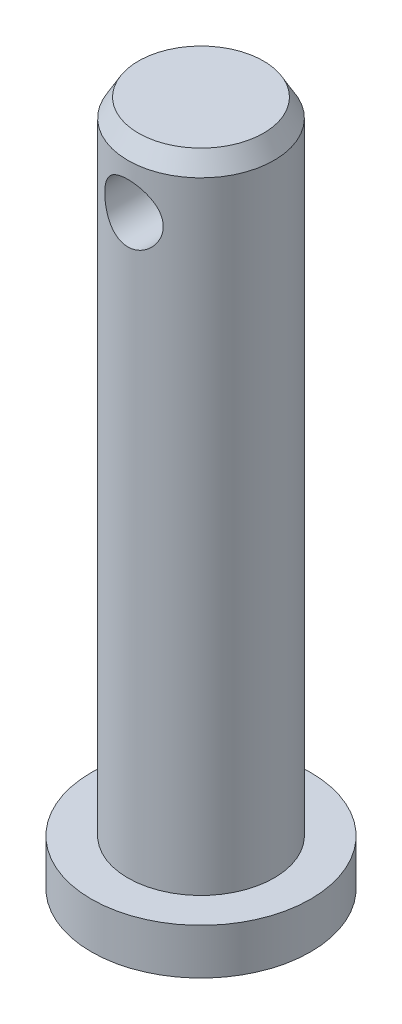
ISO-10303-21;
HEADER;
FILE_DESCRIPTION(('STEP AP214'),'2;1');
FILE_NAME('part.step','',(''),(''),'','','');
FILE_SCHEMA(('AUTOMOTIVE_DESIGN { 1 0 10303 214 1 1 1 1 }'));
ENDSEC;
DATA;
#1=APPLICATION_CONTEXT('core data for automotive mechanical design processes');
#2=APPLICATION_PROTOCOL_DEFINITION('international standard','automotive_design',2000,#1);
#3=PRODUCT_CONTEXT('',#1,'mechanical');
#4=PRODUCT('Part','Part','',(#3));
#5=PRODUCT_RELATED_PRODUCT_CATEGORY('part','',(#4));
#6=PRODUCT_DEFINITION_FORMATION('','',#4);
#7=PRODUCT_DEFINITION_CONTEXT('part definition',#1,'design');
#8=PRODUCT_DEFINITION('design','',#6,#7);
#9=PRODUCT_DEFINITION_SHAPE('','',#8);
#10=(LENGTH_UNIT() NAMED_UNIT(*) SI_UNIT(.MILLI.,.METRE.));
#11=(NAMED_UNIT(*) PLANE_ANGLE_UNIT() SI_UNIT($,.RADIAN.));
#12=(NAMED_UNIT(*) SI_UNIT($,.STERADIAN.) SOLID_ANGLE_UNIT());
#13=UNCERTAINTY_MEASURE_WITH_UNIT(LENGTH_MEASURE(1.E-05),#10,'distance_accuracy_value','');
#14=(GEOMETRIC_REPRESENTATION_CONTEXT(3) GLOBAL_UNCERTAINTY_ASSIGNED_CONTEXT((#13)) GLOBAL_UNIT_ASSIGNED_CONTEXT((#10,
#11,#12)) REPRESENTATION_CONTEXT('',''));
#15=CARTESIAN_POINT('',(0.,0.,0.));
#16=DIRECTION('',(0.,0.,1.));
#17=DIRECTION('',(1.,0.,0.));
#18=AXIS2_PLACEMENT_3D('',#15,#16,#17);
#19=CARTESIAN_POINT('',(0.,0.,0.));
#20=DIRECTION('',(0.,1.,0.));
#21=DIRECTION('',(0.,0.,1.));
#22=AXIS2_PLACEMENT_3D('',#19,#20,#21);
#23=PLANE('',#22);
#24=CARTESIAN_POINT('',(0.,0.,0.));
#25=DIRECTION('',(0.,1.,0.));
#26=DIRECTION('',(0.,0.,1.));
#27=AXIS2_PLACEMENT_3D('',#24,#25,#26);
#28=CIRCLE('',#27,6.);
#29=CARTESIAN_POINT('',(0.,0.,6.));
#30=VERTEX_POINT('',#29);
#31=EDGE_CURVE('E11',#30,#30,#28,.T.);
#32=ORIENTED_EDGE('',*,*,#31,.F.);
#33=EDGE_LOOP('',(#32));
#34=FACE_BOUND('',#33,.T.);
#35=ADVANCED_FACE('F42',(#34),#23,.F.);
#36=CARTESIAN_POINT('',(0.,0.,0.));
#37=DIRECTION('',(0.,1.,0.));
#38=DIRECTION('',(0.,0.,1.));
#39=AXIS2_PLACEMENT_3D('',#36,#37,#38);
#40=CYLINDRICAL_SURFACE('',#39,6.);
#41=CARTESIAN_POINT('',(0.,2.5,0.));
#42=DIRECTION('',(0.,1.,0.));
#43=DIRECTION('',(0.,0.,1.));
#44=AXIS2_PLACEMENT_3D('',#41,#42,#43);
#45=CIRCLE('',#44,6.);
#46=CARTESIAN_POINT('',(0.,2.5,6.));
#47=VERTEX_POINT('',#46);
#48=EDGE_CURVE('E55',#47,#47,#45,.T.);
#49=ORIENTED_EDGE('',*,*,#48,.F.);
#50=EDGE_LOOP('',(#49));
#51=FACE_BOUND('',#50,.T.);
#52=ORIENTED_EDGE('',*,*,#31,.T.);
#53=EDGE_LOOP('',(#52));
#54=FACE_BOUND('',#53,.T.);
#55=ADVANCED_FACE('F94',(#51,#54),#40,.T.);
#56=CARTESIAN_POINT('',(6.,2.5,0.));
#57=DIRECTION('',(0.,-1.,0.));
#58=DIRECTION('',(0.,0.,-1.));
#59=AXIS2_PLACEMENT_3D('',#56,#57,#58);
#60=PLANE('',#59);
#61=CARTESIAN_POINT('',(0.,2.5,0.));
#62=DIRECTION('',(0.,1.,0.));
#63=DIRECTION('',(0.,0.,1.));
#64=AXIS2_PLACEMENT_3D('',#61,#62,#63);
#65=CIRCLE('',#64,4.);
#66=CARTESIAN_POINT('',(0.,2.5,4.));
#67=VERTEX_POINT('',#66);
#68=EDGE_CURVE('E61',#67,#67,#65,.T.);
#69=ORIENTED_EDGE('',*,*,#68,.F.);
#70=EDGE_LOOP('',(#69));
#71=FACE_BOUND('',#70,.T.);
#72=ORIENTED_EDGE('',*,*,#48,.T.);
#73=EDGE_LOOP('',(#72));
#74=FACE_BOUND('',#73,.T.);
#75=ADVANCED_FACE('F89',(#71,#74),#60,.F.);
#76=CARTESIAN_POINT('',(0.,0.,0.));
#77=DIRECTION('',(0.,1.,0.));
#78=DIRECTION('',(0.,0.,1.));
#79=AXIS2_PLACEMENT_3D('',#76,#77,#78);
#80=CYLINDRICAL_SURFACE('',#79,4.);
#81=CARTESIAN_POINT('',(0.,32.4,4.));
#82=CARTESIAN_POINT('',(-0.0859944043543135,32.400007881459,3.99999416981668));
#83=CARTESIAN_POINT('',(-0.17213805127254,32.4069742016707,3.99719435445546));
#84=CARTESIAN_POINT('',(-0.341997184334318,32.434598162817,3.98626762480513));
#85=CARTESIAN_POINT('',(-0.425705422048999,32.4552930232689,3.97812622959102));
#86=CARTESIAN_POINT('',(-0.587963138181924,32.5095008624471,3.95739367370495));
#87=CARTESIAN_POINT('',(-0.666528529293571,32.5429718769734,3.94481709091258));
#88=CARTESIAN_POINT('',(-0.816857576262698,32.6216153386612,3.91645288636862));
#89=CARTESIAN_POINT('',(-0.888623581400796,32.6667837239352,3.90066637966445));
#90=CARTESIAN_POINT('',(-1.02680080605632,32.7697883988488,3.86664708936335));
#91=CARTESIAN_POINT('',(-1.09284981804017,32.8280853249922,3.84833837543352));
#92=CARTESIAN_POINT('',(-1.21454000382778,32.9547200027814,3.81168461524956));
#93=CARTESIAN_POINT('',(-1.27017608570683,33.0230626377694,3.79333955563034));
#94=CARTESIAN_POINT('',(-1.3718996538343,33.1715424561938,3.75778233437709));
#95=CARTESIAN_POINT('',(-1.41745198495638,33.2520691888186,3.74065692771961));
#96=CARTESIAN_POINT('',(-1.49420377522972,33.420429118736,3.71066917749434));
#97=CARTESIAN_POINT('',(-1.52541005142867,33.5082588222787,3.69780480995341));
#98=CARTESIAN_POINT('',(-1.57111905871669,33.6845698668737,3.67861086128655));
#99=CARTESIAN_POINT('',(-1.58631517264452,33.772840988461,3.67201136284484));
#100=CARTESIAN_POINT('',(-1.60173836931202,33.9509079986458,3.66531203239315));
#101=CARTESIAN_POINT('',(-1.60197281305058,34.0407031157,3.66520900418215));
#102=CARTESIAN_POINT('',(-1.58799149400363,34.2126053371664,3.67128400223995));
#103=CARTESIAN_POINT('',(-1.57478025144411,34.2948125715272,3.6770254003076));
#104=CARTESIAN_POINT('',(-1.53595750423825,34.4557276448054,3.69340950086269));
#105=CARTESIAN_POINT('',(-1.5103438358437,34.5344348704882,3.70405305857338));
#106=CARTESIAN_POINT('',(-1.44695578604086,34.6880142689568,3.72927588070824));
#107=CARTESIAN_POINT('',(-1.40894388985225,34.7627753912438,3.7439310342463));
#108=CARTESIAN_POINT('',(-1.32200516858577,34.9051326530893,3.77550493111912));
#109=CARTESIAN_POINT('',(-1.27307424408067,34.9727260875223,3.79242452365479));
#110=CARTESIAN_POINT('',(-1.16124047956354,35.1043277830416,3.82821389393817));
#111=CARTESIAN_POINT('',(-1.0975499703765,35.1676549835568,3.84713331980921));
#112=CARTESIAN_POINT('',(-0.960251541944149,35.2829475824016,3.88367859966626));
#113=CARTESIAN_POINT('',(-0.886641652267545,35.3349107179282,3.9013041955626));
#114=CARTESIAN_POINT('',(-0.729662122084675,35.4268939579327,3.93371745011639));
#115=CARTESIAN_POINT('',(-0.646128393077182,35.4666578249576,3.94844216076332));
#116=CARTESIAN_POINT('',(-0.472819012386305,35.5313342888624,3.97291862663007));
#117=CARTESIAN_POINT('',(-0.383046557479738,35.5562544300459,3.98267290769906));
#118=CARTESIAN_POINT('',(-0.205516710086255,35.5891586363358,3.99564911605528));
#119=CARTESIAN_POINT('',(-0.117954635188427,35.5980579634029,3.99922356666811));
#120=CARTESIAN_POINT('',(0.0574762478462553,35.6013704804229,4.00054782808505));
#121=CARTESIAN_POINT('',(0.145344970579141,35.595787425238,3.99829914865833));
#122=CARTESIAN_POINT('',(0.314746191297592,35.5709665979584,3.98846053651002));
#123=CARTESIAN_POINT('',(0.396385993420382,35.5523536157192,3.98111513076419));
#124=CARTESIAN_POINT('',(0.555308342448626,35.5028514333521,3.962075531244));
#125=CARTESIAN_POINT('',(0.632590328179878,35.4719606562651,3.95038077885224));
#126=CARTESIAN_POINT('',(0.783263028653364,35.397772048256,3.92333275816649));
#127=CARTESIAN_POINT('',(0.856462418204327,35.3541236223655,3.90787852783843));
#128=CARTESIAN_POINT('',(0.994754872997246,35.2560477408755,3.8749869179642));
#129=CARTESIAN_POINT('',(1.0598446726089,35.2016159656619,3.85754874488216));
#130=CARTESIAN_POINT('',(1.18457843442306,35.0793039896403,3.82116094110489));
#131=CARTESIAN_POINT('',(1.24357914704485,35.010773166795,3.80218753140041));
#132=CARTESIAN_POINT('',(1.34940095793097,34.8644479335925,3.76593338333706));
#133=CARTESIAN_POINT('',(1.39622004907001,34.786651999728,3.74865292421209));
#134=CARTESIAN_POINT('',(1.4766460015453,34.6228306443247,3.71771439926167));
#135=CARTESIAN_POINT('',(1.51012047562756,34.5367328006301,3.7040930470783));
#136=CARTESIAN_POINT('',(1.56183697576424,34.3594130786279,3.68258938782345));
#137=CARTESIAN_POINT('',(1.58009024421545,34.2681950353501,3.67470284556799));
#138=CARTESIAN_POINT('',(1.59977249382272,34.0902976785804,3.66617407439941));
#139=CARTESIAN_POINT('',(1.60231766584229,34.0037641283253,3.66505136806537));
#140=CARTESIAN_POINT('',(1.59344252742202,33.8315641138294,3.66891868826478));
#141=CARTESIAN_POINT('',(1.58202399033102,33.7458975408779,3.67390793859835));
#142=CARTESIAN_POINT('',(1.54645709292292,33.581334248116,3.68901319263217));
#143=CARTESIAN_POINT('',(1.52282999485678,33.5023037804536,3.6989186546196));
#144=CARTESIAN_POINT('',(1.46400435879281,33.3492970963092,3.72259200986157));
#145=CARTESIAN_POINT('',(1.42880262511505,33.2753222824801,3.73636096964805));
#146=CARTESIAN_POINT('',(1.34549821020778,33.1299123045834,3.76718887683593));
#147=CARTESIAN_POINT('',(1.29677226812759,33.0588650638956,3.78439105850594));
#148=CARTESIAN_POINT('',(1.18871369541719,32.925605346237,3.8197104349779));
#149=CARTESIAN_POINT('',(1.1293778678545,32.8633955422973,3.83782790438725));
#150=CARTESIAN_POINT('',(0.997204405017969,32.7454377173891,3.87434853669915));
#151=CARTESIAN_POINT('',(0.923740800916909,32.6903701544815,3.89269406369748));
#152=CARTESIAN_POINT('',(0.767920256228621,32.5933303659027,3.92640325370973));
#153=CARTESIAN_POINT('',(0.685559203637788,32.551364230278,3.94176552874325));
#154=CARTESIAN_POINT('',(0.51579044999616,32.4827022278478,3.96751771852689));
#155=CARTESIAN_POINT('',(0.428505294575755,32.4557365411517,3.97799490444022));
#156=CARTESIAN_POINT('',(0.250301237024974,32.4170887032366,3.99315444967493));
#157=CARTESIAN_POINT('',(0.159394820687126,32.4053580506049,3.9978551959651));
#158=CARTESIAN_POINT('',(0.0455298383127411,32.4004836952174,3.99980719603309));
#159=CARTESIAN_POINT('',(0.0227701509926054,32.3999979130966,4.00000154375341));
#160=CARTESIAN_POINT('',(0.,32.4,4.));
#161=B_SPLINE_CURVE_WITH_KNOTS('',3,(#81,#82,#83,#84,#85,#86,#87,#88,#89,#90,#91,#92,#93,#94,
#95,#96,#97,#98,#99,#100,#101,#102,#103,#104,#105,#106,#107,#108,#109,#110,#111,#112,#113,#114,
#115,#116,#117,#118,#119,#120,#121,#122,#123,#124,#125,#126,#127,#128,#129,#130,#131,#132,#133,
#134,#135,#136,#137,#138,#139,#140,#141,#142,#143,#144,#145,#146,#147,#148,#149,#150,#151,#152,
#153,#154,#155,#156,#157,#158,#159,#160),.UNSPECIFIED.,.T.,.F.,(4,2,2,2,2,2,2,2,2,2,2,2,2,2,2,2,
2,2,2,2,2,2,2,2,2,2,2,2,2,2,2,2,2,2,2,2,2,2,2,4),(0.,0.257922390314458,0.516546908806349,
0.774329165977269,1.03202202854388,1.30077905360318,1.56966715947529,1.85052207055374,
2.13124338494615,2.39923284247063,2.66709045072391,2.91630662721098,3.16556629804838,
3.41991301039053,3.67435537550547,3.94846679349246,4.22263274271786,4.50221530530245,
4.78165564891032,5.04455347622406,5.30738314856066,5.55840364451493,5.80945639195037,
6.0681881071861,6.32702367599175,6.60294779699531,6.87891735234999,7.15756036112663,
7.43599738116747,7.69439738714197,7.95276458050436,8.20091454839015,8.44913308644129,
8.71156374445354,8.97407361078714,9.25360338827069,9.53326290912426,9.80771440810655,
10.0812900192347,10.1495843671744),.UNSPECIFIED.);
#162=CARTESIAN_POINT('',(0.,32.4,4.));
#163=VERTEX_POINT('',#162);
#164=EDGE_CURVE('E45',#163,#163,#161,.T.);
#165=ORIENTED_EDGE('',*,*,#164,.T.);
#166=EDGE_LOOP('',(#165));
#167=FACE_BOUND('',#166,.T.);
#168=CARTESIAN_POINT('',(1.6,34.,-3.66606055596467));
#169=CARTESIAN_POINT('',(1.59999060336303,34.0857115984799,-3.66606921325137));
#170=CARTESIAN_POINT('',(1.59307185487548,34.1715444277638,-3.66910881987412));
#171=CARTESIAN_POINT('',(1.56565522447418,34.3407478663017,-3.68088731350276));
#172=CARTESIAN_POINT('',(1.5451226435537,34.4241116136644,-3.68964076309481));
#173=CARTESIAN_POINT('',(1.49138802605496,34.585642353576,-3.71168364633037));
#174=CARTESIAN_POINT('',(1.45823372202034,34.6638276378882,-3.72495597085692));
#175=CARTESIAN_POINT('',(1.38033621549729,34.8135080406877,-3.75451732076224));
#176=CARTESIAN_POINT('',(1.335595543414,34.8850046153207,-3.77080568723138));
#177=CARTESIAN_POINT('',(1.23305757966994,35.0234083217932,-3.80560692040826));
#178=CARTESIAN_POINT('',(1.17470348618186,35.0898851383436,-3.82419134366997));
#179=CARTESIAN_POINT('',(1.04776728461924,35.2124231978523,-3.86089965583049));
#180=CARTESIAN_POINT('',(0.979181617340549,35.2684808010319,-3.87902338189098));
#181=CARTESIAN_POINT('',(0.830405048285107,35.3707251175862,-3.91362726325483));
#182=CARTESIAN_POINT('',(0.749863172489829,35.4164354411765,-3.93001442946855));
#183=CARTESIAN_POINT('',(0.581460258300101,35.4934748547118,-3.95843142105237));
#184=CARTESIAN_POINT('',(0.493602215430376,35.5248097966256,-3.97046301907739));
#185=CARTESIAN_POINT('',(0.317573141471121,35.5706731891499,-3.98830660006628));
#186=CARTESIAN_POINT('',(0.229623187843691,35.5859418512712,-3.99439149420285));
#187=CARTESIAN_POINT('',(0.0522130629101266,35.6016227885302,-4.00064248546162));
#188=CARTESIAN_POINT('',(-0.0372465326603166,35.6020406047479,-4.0008107901545));
#189=CARTESIAN_POINT('',(-0.209785995772244,35.58841378418,-3.99537570257429));
#190=CARTESIAN_POINT('',(-0.292941962299222,35.5751801818025,-3.99009597417469));
#191=CARTESIAN_POINT('',(-0.455738487374666,35.5360056989514,-3.97479433175032));
#192=CARTESIAN_POINT('',(-0.535378787512122,35.5100638860797,-3.9647720697689));
#193=CARTESIAN_POINT('',(-0.69031835080932,35.445890813699,-3.9407745956616));
#194=CARTESIAN_POINT('',(-0.765534098703703,35.4074802281476,-3.9267420837344));
#195=CARTESIAN_POINT('',(-0.908646520592455,35.3196279944648,-3.89611668143758));
#196=CARTESIAN_POINT('',(-0.976540674172882,35.2701825655219,-3.87952291412059));
#197=CARTESIAN_POINT('',(-1.10781506239372,35.1578806912427,-3.84417309742667));
#198=CARTESIAN_POINT('',(-1.17060627621891,35.0943568859329,-3.82534661216192));
#199=CARTESIAN_POINT('',(-1.28488593230826,34.9576075425432,-3.78849328771823));
#200=CARTESIAN_POINT('',(-1.33637067500773,34.8843788414767,-3.77046671181078));
#201=CARTESIAN_POINT('',(-1.42792335099434,34.7276647820728,-3.7367751795345));
#202=CARTESIAN_POINT('',(-1.46762772138792,34.643948135613,-3.72119131345105));
#203=CARTESIAN_POINT('',(-1.53214100797301,34.4702276076304,-3.69510072373859));
#204=CARTESIAN_POINT('',(-1.55695959872352,34.3802278521833,-3.68459070338672));
#205=CARTESIAN_POINT('',(-1.58956395906557,34.2023713780512,-3.67063807738052));
#206=CARTESIAN_POINT('',(-1.59829767744673,34.1147196423039,-3.66680293158461));
#207=CARTESIAN_POINT('',(-1.60124906115921,33.9391382337856,-3.66551598301679));
#208=CARTESIAN_POINT('',(-1.59547112847431,33.8512086533777,-3.6680622444997));
#209=CARTESIAN_POINT('',(-1.57042631583082,33.6828328520361,-3.67884835485706));
#210=CARTESIAN_POINT('',(-1.55194644961877,33.6022456500804,-3.68675566238216));
#211=CARTESIAN_POINT('',(-1.50304334952902,33.4453692761712,-3.70696040822297));
#212=CARTESIAN_POINT('',(-1.47261746744192,33.3690810615142,-3.71925881990995));
#213=CARTESIAN_POINT('',(-1.39930851158516,33.2195181137636,-3.7474702548796));
#214=CARTESIAN_POINT('',(-1.35597029461168,33.1464910490444,-3.76350963711308));
#215=CARTESIAN_POINT('',(-1.2585321795535,33.0084136100467,-3.7972030812627));
#216=CARTESIAN_POINT('',(-1.20442789878559,32.9433665017635,-3.8148577991685));
#217=CARTESIAN_POINT('',(-1.08227536934439,32.8181012731206,-3.85136732777118));
#218=CARTESIAN_POINT('',(-1.01349234355608,32.7585947477672,-3.87021445828162));
#219=CARTESIAN_POINT('',(-0.866466906695076,32.6518583387117,-3.9057583565405));
#220=CARTESIAN_POINT('',(-0.788224110774293,32.6046289547222,-3.92245503674592));
#221=CARTESIAN_POINT('',(-0.624223947201412,32.523961898831,-3.95186972720228));
#222=CARTESIAN_POINT('',(-0.538468384795257,32.4905209246674,-3.96458868992219));
#223=CARTESIAN_POINT('',(-0.361914872735385,32.4387609180739,-3.98458170775432));
#224=CARTESIAN_POINT('',(-0.271119688235421,32.4204336788479,-3.99185871766035));
#225=CARTESIAN_POINT('',(-0.0934532082770485,32.4003962386997,-3.9998320656841));
#226=CARTESIAN_POINT('',(-0.00671239407445052,32.3976798972299,-4.00092677395898));
#227=CARTESIAN_POINT('',(0.165947068586589,32.4062843834273,-3.99748833902874));
#228=CARTESIAN_POINT('',(0.251865839515692,32.4176030862285,-3.9929560477353));
#229=CARTESIAN_POINT('',(0.417736721557123,32.4532374306868,-3.97897210691404));
#230=CARTESIAN_POINT('',(0.497791043718701,32.4771431568604,-3.96967584507464));
#231=CARTESIAN_POINT('',(0.652737883807146,32.5368422436495,-3.9471595826563));
#232=CARTESIAN_POINT('',(0.727629446613816,32.5726377968163,-3.93393885843209));
#233=CARTESIAN_POINT('',(0.873762433484887,32.6568825587915,-3.90414475488046));
#234=CARTESIAN_POINT('',(0.944696309445134,32.7058210359081,-3.88744903782584));
#235=CARTESIAN_POINT('',(1.07764322281925,32.8142308153431,-3.85271522549158));
#236=CARTESIAN_POINT('',(1.1396525485966,32.8737064771681,-3.83467657640401));
#237=CARTESIAN_POINT('',(1.25696101206879,33.00585217962,-3.79790210847538));
#238=CARTESIAN_POINT('',(1.31160710975922,33.0791110987209,-3.77919226084307));
#239=CARTESIAN_POINT('',(1.40787796035152,33.234353709943,-3.74439737180144));
#240=CARTESIAN_POINT('',(1.44950118231999,33.3163384263279,-3.72831263909964));
#241=CARTESIAN_POINT('',(1.51519287013865,33.4792297614785,-3.70207091566326));
#242=CARTESIAN_POINT('',(1.54050201133136,33.5595721878009,-3.69151134889319));
#243=CARTESIAN_POINT('',(1.57817420625471,33.7235883357043,-3.67556802883171));
#244=CARTESIAN_POINT('',(1.59057333431041,33.8072520927736,-3.6701698565774));
#245=CARTESIAN_POINT('',(1.59877140664814,33.9275020498703,-3.66659567006108));
#246=CARTESIAN_POINT('',(1.6000039751959,33.9637401767981,-3.66605689354686));
#247=CARTESIAN_POINT('',(1.6,34.,-3.66606055596467));
#248=B_SPLINE_CURVE_WITH_KNOTS('',3,(#168,#169,#170,#171,#172,#173,#174,#175,#176,#177,#178,
#179,#180,#181,#182,#183,#184,#185,#186,#187,#188,#189,#190,#191,#192,#193,#194,#195,#196,#197,
#198,#199,#200,#201,#202,#203,#204,#205,#206,#207,#208,#209,#210,#211,#212,#213,#214,#215,#216,
#217,#218,#219,#220,#221,#222,#223,#224,#225,#226,#227,#228,#229,#230,#231,#232,#233,#234,#235,
#236,#237,#238,#239,#240,#241,#242,#243,#244,#245,#246,#247),.UNSPECIFIED.,.T.,.F.,(4,2,2,2,2,2,
2,2,2,2,2,2,2,2,2,2,2,2,2,2,2,2,2,2,2,2,2,2,2,2,2,2,2,2,2,2,2,2,2,4),(0.,0.257022119014128,
0.514701868657793,0.771416658634713,1.02807543059089,1.29804494627539,1.56810859478673,
1.84882135273142,2.12941973575583,2.39643346309746,2.66334756244537,2.91526915864241,
3.16720924103247,3.42294640187918,3.67877131952024,3.95139235265084,4.22410245701701,
4.5045156697166,4.78474643835288,5.04785718014743,5.31088811921559,5.55893798463323,
5.80704286916518,6.06520923717368,6.32348091615887,6.60082987392791,6.87819011877406,
7.15548389845457,7.43262700758516,7.69168831799969,7.95071041205288,8.20177595549889,
8.45288782258075,8.71509640907147,8.97741373246572,9.25597002623698,9.53455905402558,
9.78813328650468,10.040997041706,10.1497288441659),.UNSPECIFIED.);
#249=CARTESIAN_POINT('',(1.6,34.,-3.66606055596467));
#250=VERTEX_POINT('',#249);
#251=EDGE_CURVE('E64',#250,#250,#248,.T.);
#252=ORIENTED_EDGE('',*,*,#251,.T.);
#253=EDGE_LOOP('',(#252));
#254=FACE_BOUND('',#253,.T.);
#255=CARTESIAN_POINT('',(0.,36.5,0.));
#256=DIRECTION('',(0.,1.,0.));
#257=DIRECTION('',(0.,0.,1.));
#258=AXIS2_PLACEMENT_3D('',#255,#256,#257);
#259=CIRCLE('',#258,4.);
#260=CARTESIAN_POINT('',(0.,36.5,4.));
#261=VERTEX_POINT('',#260);
#262=EDGE_CURVE('E112',#261,#261,#259,.T.);
#263=ORIENTED_EDGE('',*,*,#262,.F.);
#264=EDGE_LOOP('',(#263));
#265=FACE_BOUND('',#264,.T.);
#266=ORIENTED_EDGE('',*,*,#68,.T.);
#267=EDGE_LOOP('',(#266));
#268=FACE_BOUND('',#267,.T.);
#269=ADVANCED_FACE('F70',(#167,#254,#265,#268),#80,.T.);
#270=CARTESIAN_POINT('',(0.,36.5,0.));
#271=DIRECTION('',(0.,-1.,0.));
#272=DIRECTION('',(0.,0.,-1.));
#273=AXIS2_PLACEMENT_3D('',#270,#271,#272);
#274=CONICAL_SURFACE('',#273,4.,0.523598775598293);
#275=CARTESIAN_POINT('',(0.,37.5,0.));
#276=DIRECTION('',(0.,1.,0.));
#277=DIRECTION('',(0.,0.,1.));
#278=AXIS2_PLACEMENT_3D('',#275,#276,#277);
#279=CIRCLE('',#278,3.42264973081038);
#280=CARTESIAN_POINT('',(0.,37.5,3.42264973081038));
#281=VERTEX_POINT('',#280);
#282=EDGE_CURVE('E115',#281,#281,#279,.T.);
#283=ORIENTED_EDGE('',*,*,#282,.F.);
#284=EDGE_LOOP('',(#283));
#285=FACE_BOUND('',#284,.T.);
#286=ORIENTED_EDGE('',*,*,#262,.T.);
#287=EDGE_LOOP('',(#286));
#288=FACE_BOUND('',#287,.T.);
#289=ADVANCED_FACE('F82',(#285,#288),#274,.T.);
#290=CARTESIAN_POINT('',(3.42264973081038,37.5,0.));
#291=DIRECTION('',(0.,-1.,0.));
#292=DIRECTION('',(0.,0.,-1.));
#293=AXIS2_PLACEMENT_3D('',#290,#291,#292);
#294=PLANE('',#293);
#295=ORIENTED_EDGE('',*,*,#282,.T.);
#296=EDGE_LOOP('',(#295));
#297=FACE_BOUND('',#296,.T.);
#298=ADVANCED_FACE('F78',(#297),#294,.F.);
#299=CARTESIAN_POINT('',(0.,34.,-6.));
#300=DIRECTION('',(0.,0.,1.));
#301=DIRECTION('',(1.,0.,0.));
#302=AXIS2_PLACEMENT_3D('',#299,#300,#301);
#303=CYLINDRICAL_SURFACE('',#302,1.6);
#304=ORIENTED_EDGE('',*,*,#251,.F.);
#305=EDGE_LOOP('',(#304));
#306=FACE_BOUND('',#305,.T.);
#307=ORIENTED_EDGE('',*,*,#164,.F.);
#308=EDGE_LOOP('',(#307));
#309=FACE_BOUND('',#308,.T.);
#310=ADVANCED_FACE('F74',(#306,#309),#303,.F.);
#311=CLOSED_SHELL('',(#35,#55,#75,#269,#289,#298,#310));
#312=MANIFOLD_SOLID_BREP('B2',#311);
#313=ADVANCED_BREP_SHAPE_REPRESENTATION('',(#18,#312),#14);
#314=SHAPE_DEFINITION_REPRESENTATION(#9,#313);
ENDSEC;
END-ISO-10303-21;
